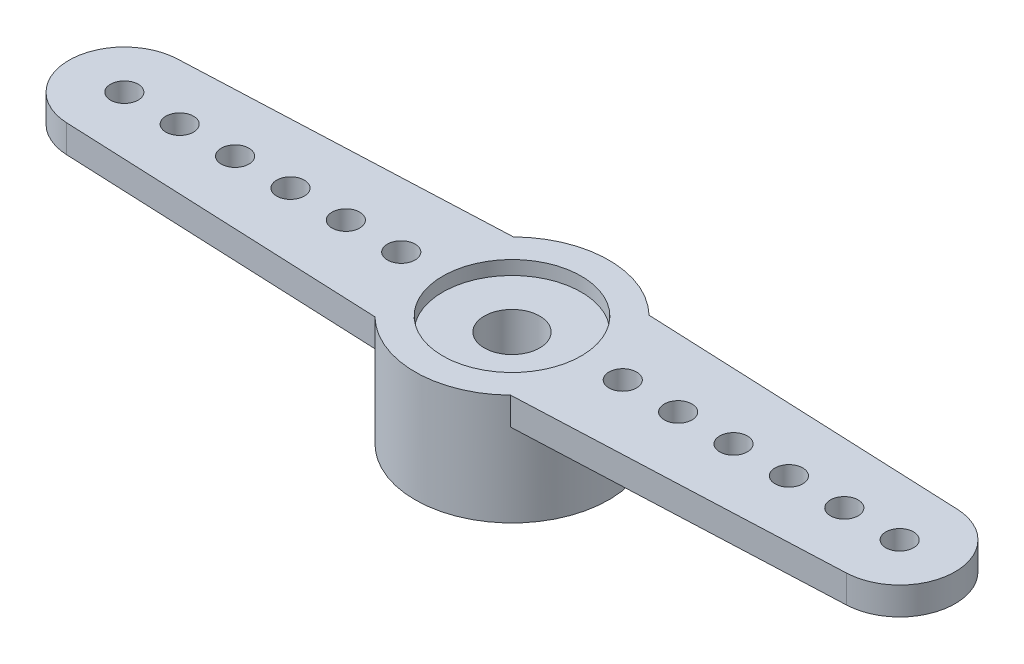
ISO-10303-21;
HEADER;
FILE_DESCRIPTION(('STEP AP214'),'2;1');
FILE_NAME('part.step','',(''),(''),'','','');
FILE_SCHEMA(('AUTOMOTIVE_DESIGN { 1 0 10303 214 1 1 1 1 }'));
ENDSEC;
DATA;
#1=APPLICATION_CONTEXT('core data for automotive mechanical design processes');
#2=APPLICATION_PROTOCOL_DEFINITION('international standard','automotive_design',2000,#1);
#3=PRODUCT_CONTEXT('',#1,'mechanical');
#4=PRODUCT('Part','Part','',(#3));
#5=PRODUCT_RELATED_PRODUCT_CATEGORY('part','',(#4));
#6=PRODUCT_DEFINITION_FORMATION('','',#4);
#7=PRODUCT_DEFINITION_CONTEXT('part definition',#1,'design');
#8=PRODUCT_DEFINITION('design','',#6,#7);
#9=PRODUCT_DEFINITION_SHAPE('','',#8);
#10=(LENGTH_UNIT() NAMED_UNIT(*) SI_UNIT(.MILLI.,.METRE.));
#11=(NAMED_UNIT(*) PLANE_ANGLE_UNIT() SI_UNIT($,.RADIAN.));
#12=(NAMED_UNIT(*) SI_UNIT($,.STERADIAN.) SOLID_ANGLE_UNIT());
#13=UNCERTAINTY_MEASURE_WITH_UNIT(LENGTH_MEASURE(1.E-05),#10,'distance_accuracy_value','');
#14=(GEOMETRIC_REPRESENTATION_CONTEXT(3) GLOBAL_UNCERTAINTY_ASSIGNED_CONTEXT((#13)) GLOBAL_UNIT_ASSIGNED_CONTEXT((#10,
#11,#12)) REPRESENTATION_CONTEXT('',''));
#15=CARTESIAN_POINT('',(0.,0.,0.));
#16=DIRECTION('',(0.,0.,1.));
#17=DIRECTION('',(1.,0.,0.));
#18=AXIS2_PLACEMENT_3D('',#15,#16,#17);
#19=CARTESIAN_POINT('',(0.,4.,0.));
#20=DIRECTION('',(0.,-1.,0.));
#21=DIRECTION('',(0.,0.,-1.));
#22=AXIS2_PLACEMENT_3D('',#19,#20,#21);
#23=CYLINDRICAL_SURFACE('',#22,3.5);
#24=CARTESIAN_POINT('',(0.,0.,0.));
#25=DIRECTION('',(0.,1.,0.));
#26=DIRECTION('',(0.,0.,1.));
#27=AXIS2_PLACEMENT_3D('',#24,#25,#26);
#28=CIRCLE('',#27,3.5);
#29=CARTESIAN_POINT('',(0.,0.,3.5));
#30=VERTEX_POINT('',#29);
#31=EDGE_CURVE('E210',#30,#30,#28,.T.);
#32=ORIENTED_EDGE('',*,*,#31,.T.);
#33=EDGE_LOOP('',(#32));
#34=FACE_BOUND('',#33,.T.);
#35=DIRECTION('',(0.,1.,0.));
#36=VECTOR('',#35,1.);
#37=CARTESIAN_POINT('',(2.44948974278318,3.,2.5));
#38=LINE('',#37,#36);
#39=CARTESIAN_POINT('',(2.44948974278318,3.,2.5));
#40=VERTEX_POINT('',#39);
#41=CARTESIAN_POINT('',(2.44948974278318,4.,2.5));
#42=VERTEX_POINT('',#41);
#43=EDGE_CURVE('E133',#40,#42,#38,.T.);
#44=ORIENTED_EDGE('',*,*,#43,.T.);
#45=CARTESIAN_POINT('',(0.,4.,0.));
#46=DIRECTION('',(0.,1.,0.));
#47=DIRECTION('',(0.,0.,1.));
#48=AXIS2_PLACEMENT_3D('',#45,#46,#47);
#49=CIRCLE('',#48,3.5);
#50=CARTESIAN_POINT('',(-2.44948974278318,4.,2.5));
#51=VERTEX_POINT('',#50);
#52=EDGE_CURVE('E50',#51,#42,#49,.T.);
#53=ORIENTED_EDGE('',*,*,#52,.F.);
#54=DIRECTION('',(0.,1.,0.));
#55=VECTOR('',#54,1.);
#56=CARTESIAN_POINT('',(-2.44948974278318,3.,2.5));
#57=LINE('',#56,#55);
#58=CARTESIAN_POINT('',(-2.44948974278318,3.,2.5));
#59=VERTEX_POINT('',#58);
#60=EDGE_CURVE('E190',#59,#51,#57,.T.);
#61=ORIENTED_EDGE('',*,*,#60,.F.);
#62=CARTESIAN_POINT('',(0.,3.,0.));
#63=DIRECTION('',(0.,1.,0.));
#64=DIRECTION('',(0.,0.,1.));
#65=AXIS2_PLACEMENT_3D('',#62,#63,#64);
#66=CIRCLE('',#65,3.5);
#67=CARTESIAN_POINT('',(-3.5,3.,0.));
#68=VERTEX_POINT('',#67);
#69=EDGE_CURVE('E174',#68,#59,#66,.T.);
#70=ORIENTED_EDGE('',*,*,#69,.F.);
#71=CARTESIAN_POINT('',(-2.44948974278318,3.,-2.5));
#72=VERTEX_POINT('',#71);
#73=EDGE_CURVE('E175',#72,#68,#66,.T.);
#74=ORIENTED_EDGE('',*,*,#73,.F.);
#75=DIRECTION('',(0.,1.,0.));
#76=VECTOR('',#75,1.);
#77=CARTESIAN_POINT('',(-2.44948974278318,3.,-2.5));
#78=LINE('',#77,#76);
#79=CARTESIAN_POINT('',(-2.44948974278318,4.,-2.5));
#80=VERTEX_POINT('',#79);
#81=EDGE_CURVE('E185',#72,#80,#78,.T.);
#82=ORIENTED_EDGE('',*,*,#81,.T.);
#83=CARTESIAN_POINT('',(2.44948974278318,4.,-2.5));
#84=VERTEX_POINT('',#83);
#85=EDGE_CURVE('E217',#84,#80,#49,.T.);
#86=ORIENTED_EDGE('',*,*,#85,.F.);
#87=DIRECTION('',(0.,1.,0.));
#88=VECTOR('',#87,1.);
#89=CARTESIAN_POINT('',(2.44948974278318,3.,-2.5));
#90=LINE('',#89,#88);
#91=CARTESIAN_POINT('',(2.44948974278318,3.,-2.5));
#92=VERTEX_POINT('',#91);
#93=EDGE_CURVE('E247',#92,#84,#90,.T.);
#94=ORIENTED_EDGE('',*,*,#93,.F.);
#95=CARTESIAN_POINT('',(0.,3.,0.));
#96=DIRECTION('',(0.,1.,0.));
#97=DIRECTION('',(0.,0.,1.));
#98=AXIS2_PLACEMENT_3D('',#95,#96,#97);
#99=CIRCLE('',#98,3.5);
#100=CARTESIAN_POINT('',(3.5,3.,0.));
#101=VERTEX_POINT('',#100);
#102=EDGE_CURVE('E151',#101,#92,#99,.T.);
#103=ORIENTED_EDGE('',*,*,#102,.F.);
#104=EDGE_CURVE('E152',#40,#101,#99,.T.);
#105=ORIENTED_EDGE('',*,*,#104,.F.);
#106=EDGE_LOOP('',(#44,#53,#61,#70,#74,#82,#86,#94,#103,#105));
#107=FACE_BOUND('',#106,.T.);
#108=ADVANCED_FACE('F41',(#34,#107),#23,.T.);
#109=CARTESIAN_POINT('',(0.,4.,0.));
#110=DIRECTION('',(0.,-1.,0.));
#111=DIRECTION('',(0.,0.,-1.));
#112=AXIS2_PLACEMENT_3D('',#109,#110,#111);
#113=CYLINDRICAL_SURFACE('',#112,2.5);
#114=CARTESIAN_POINT('',(0.,0.,0.));
#115=DIRECTION('',(0.,1.,0.));
#116=DIRECTION('',(0.,0.,1.));
#117=AXIS2_PLACEMENT_3D('',#114,#115,#116);
#118=CIRCLE('',#117,2.5);
#119=CARTESIAN_POINT('',(0.,0.,2.5));
#120=VERTEX_POINT('',#119);
#121=EDGE_CURVE('E211',#120,#120,#118,.T.);
#122=ORIENTED_EDGE('',*,*,#121,.F.);
#123=EDGE_LOOP('',(#122));
#124=FACE_BOUND('',#123,.T.);
#125=CARTESIAN_POINT('',(0.,2.,0.));
#126=DIRECTION('',(0.,1.,0.));
#127=DIRECTION('',(0.,0.,1.));
#128=AXIS2_PLACEMENT_3D('',#125,#126,#127);
#129=CIRCLE('',#128,2.5);
#130=CARTESIAN_POINT('',(0.,2.,2.5));
#131=VERTEX_POINT('',#130);
#132=EDGE_CURVE('E44',#131,#131,#129,.T.);
#133=ORIENTED_EDGE('',*,*,#132,.T.);
#134=EDGE_LOOP('',(#133));
#135=FACE_BOUND('',#134,.T.);
#136=ADVANCED_FACE('F353',(#124,#135),#113,.F.);
#137=CARTESIAN_POINT('',(0.,4.,0.));
#138=DIRECTION('',(0.,1.,0.));
#139=DIRECTION('',(0.,0.,1.));
#140=AXIS2_PLACEMENT_3D('',#137,#138,#139);
#141=PLANE('',#140);
#142=CARTESIAN_POINT('',(14.,4.,0.));
#143=DIRECTION('',(0.,1.,0.));
#144=DIRECTION('',(0.,0.,1.));
#145=AXIS2_PLACEMENT_3D('',#142,#143,#144);
#146=CIRCLE('',#145,0.500000000000001);
#147=CARTESIAN_POINT('',(14.,4.,0.500000000000001));
#148=VERTEX_POINT('',#147);
#149=EDGE_CURVE('E297',#148,#148,#146,.T.);
#150=ORIENTED_EDGE('',*,*,#149,.F.);
#151=EDGE_LOOP('',(#150));
#152=FACE_BOUND('',#151,.T.);
#153=CARTESIAN_POINT('',(-14.,4.,0.));
#154=DIRECTION('',(0.,1.,0.));
#155=DIRECTION('',(0.,0.,-1.));
#156=AXIS2_PLACEMENT_3D('',#153,#154,#155);
#157=CIRCLE('',#156,0.500000000000001);
#158=CARTESIAN_POINT('',(-14.,4.,-0.500000000000001));
#159=VERTEX_POINT('',#158);
#160=EDGE_CURVE('E298',#159,#159,#157,.T.);
#161=ORIENTED_EDGE('',*,*,#160,.F.);
#162=EDGE_LOOP('',(#161));
#163=FACE_BOUND('',#162,.T.);
#164=CARTESIAN_POINT('',(-12.,4.,0.));
#165=DIRECTION('',(0.,1.,0.));
#166=DIRECTION('',(0.,0.,-1.));
#167=AXIS2_PLACEMENT_3D('',#164,#165,#166);
#168=CIRCLE('',#167,0.500000000000001);
#169=CARTESIAN_POINT('',(-12.,4.,-0.500000000000001));
#170=VERTEX_POINT('',#169);
#171=EDGE_CURVE('E313',#170,#170,#168,.T.);
#172=ORIENTED_EDGE('',*,*,#171,.F.);
#173=EDGE_LOOP('',(#172));
#174=FACE_BOUND('',#173,.T.);
#175=CARTESIAN_POINT('',(-10.,4.,0.));
#176=DIRECTION('',(0.,1.,0.));
#177=DIRECTION('',(0.,0.,-1.));
#178=AXIS2_PLACEMENT_3D('',#175,#176,#177);
#179=CIRCLE('',#178,0.500000000000001);
#180=CARTESIAN_POINT('',(-10.,4.,-0.500000000000001));
#181=VERTEX_POINT('',#180);
#182=EDGE_CURVE('E314',#181,#181,#179,.T.);
#183=ORIENTED_EDGE('',*,*,#182,.F.);
#184=EDGE_LOOP('',(#183));
#185=FACE_BOUND('',#184,.T.);
#186=CARTESIAN_POINT('',(12.,4.,0.));
#187=DIRECTION('',(0.,1.,0.));
#188=DIRECTION('',(0.,0.,1.));
#189=AXIS2_PLACEMENT_3D('',#186,#187,#188);
#190=CIRCLE('',#189,0.500000000000001);
#191=CARTESIAN_POINT('',(12.,4.,0.500000000000001));
#192=VERTEX_POINT('',#191);
#193=EDGE_CURVE('E266',#192,#192,#190,.T.);
#194=ORIENTED_EDGE('',*,*,#193,.F.);
#195=EDGE_LOOP('',(#194));
#196=FACE_BOUND('',#195,.T.);
#197=CARTESIAN_POINT('',(10.,4.,0.));
#198=DIRECTION('',(0.,1.,0.));
#199=DIRECTION('',(0.,0.,1.));
#200=AXIS2_PLACEMENT_3D('',#197,#198,#199);
#201=CIRCLE('',#200,0.500000000000001);
#202=CARTESIAN_POINT('',(10.,4.,0.500000000000001));
#203=VERTEX_POINT('',#202);
#204=EDGE_CURVE('E265',#203,#203,#201,.T.);
#205=ORIENTED_EDGE('',*,*,#204,.F.);
#206=EDGE_LOOP('',(#205));
#207=FACE_BOUND('',#206,.T.);
#208=CARTESIAN_POINT('',(8.,4.,0.));
#209=DIRECTION('',(0.,1.,0.));
#210=DIRECTION('',(0.,0.,1.));
#211=AXIS2_PLACEMENT_3D('',#208,#209,#210);
#212=CIRCLE('',#211,0.500000000000001);
#213=CARTESIAN_POINT('',(8.,4.,0.500000000000001));
#214=VERTEX_POINT('',#213);
#215=EDGE_CURVE('E275',#214,#214,#212,.T.);
#216=ORIENTED_EDGE('',*,*,#215,.F.);
#217=EDGE_LOOP('',(#216));
#218=FACE_BOUND('',#217,.T.);
#219=CARTESIAN_POINT('',(6.,4.,0.));
#220=DIRECTION('',(0.,1.,0.));
#221=DIRECTION('',(0.,0.,1.));
#222=AXIS2_PLACEMENT_3D('',#219,#220,#221);
#223=CIRCLE('',#222,0.500000000000001);
#224=CARTESIAN_POINT('',(6.,4.,0.500000000000001));
#225=VERTEX_POINT('',#224);
#226=EDGE_CURVE('E283',#225,#225,#223,.T.);
#227=ORIENTED_EDGE('',*,*,#226,.F.);
#228=EDGE_LOOP('',(#227));
#229=FACE_BOUND('',#228,.T.);
#230=CARTESIAN_POINT('',(-8.,4.,0.));
#231=DIRECTION('',(0.,1.,0.));
#232=DIRECTION('',(0.,0.,-1.));
#233=AXIS2_PLACEMENT_3D('',#230,#231,#232);
#234=CIRCLE('',#233,0.500000000000001);
#235=CARTESIAN_POINT('',(-8.,4.,-0.500000000000001));
#236=VERTEX_POINT('',#235);
#237=EDGE_CURVE('E336',#236,#236,#234,.T.);
#238=ORIENTED_EDGE('',*,*,#237,.F.);
#239=EDGE_LOOP('',(#238));
#240=FACE_BOUND('',#239,.T.);
#241=CARTESIAN_POINT('',(-6.,4.,0.));
#242=DIRECTION('',(0.,1.,0.));
#243=DIRECTION('',(0.,0.,-1.));
#244=AXIS2_PLACEMENT_3D('',#241,#242,#243);
#245=CIRCLE('',#244,0.500000000000001);
#246=CARTESIAN_POINT('',(-6.,4.,-0.500000000000001));
#247=VERTEX_POINT('',#246);
#248=EDGE_CURVE('E327',#247,#247,#245,.T.);
#249=ORIENTED_EDGE('',*,*,#248,.F.);
#250=EDGE_LOOP('',(#249));
#251=FACE_BOUND('',#250,.T.);
#252=CARTESIAN_POINT('',(-4.,4.,0.));
#253=DIRECTION('',(0.,1.,0.));
#254=DIRECTION('',(0.,0.,-1.));
#255=AXIS2_PLACEMENT_3D('',#252,#253,#254);
#256=CIRCLE('',#255,0.500000000000001);
#257=CARTESIAN_POINT('',(-4.,4.,-0.500000000000001));
#258=VERTEX_POINT('',#257);
#259=EDGE_CURVE('E328',#258,#258,#256,.T.);
#260=ORIENTED_EDGE('',*,*,#259,.F.);
#261=EDGE_LOOP('',(#260));
#262=FACE_BOUND('',#261,.T.);
#263=CARTESIAN_POINT('',(4.,4.,0.));
#264=DIRECTION('',(0.,1.,0.));
#265=DIRECTION('',(0.,0.,1.));
#266=AXIS2_PLACEMENT_3D('',#263,#264,#265);
#267=CIRCLE('',#266,0.500000000000001);
#268=CARTESIAN_POINT('',(4.,4.,0.500000000000001));
#269=VERTEX_POINT('',#268);
#270=EDGE_CURVE('E256',#269,#269,#267,.T.);
#271=ORIENTED_EDGE('',*,*,#270,.F.);
#272=EDGE_LOOP('',(#271));
#273=FACE_BOUND('',#272,.T.);
#274=ORIENTED_EDGE('',*,*,#52,.T.);
#275=DIRECTION('',(-0.999071318541253,0.,0.0430871264792976));
#276=VECTOR('',#275,1.);
#277=CARTESIAN_POINT('',(0.112165259513997,4.,2.60080220877607));
#278=LINE('',#277,#276);
#279=CARTESIAN_POINT('',(14.0861742529586,4.,1.99814263708251));
#280=VERTEX_POINT('',#279);
#281=EDGE_CURVE('E111',#280,#42,#278,.T.);
#282=ORIENTED_EDGE('',*,*,#281,.F.);
#283=CARTESIAN_POINT('',(14.,4.,0.));
#284=DIRECTION('',(0.,1.,0.));
#285=DIRECTION('',(0.,0.,1.));
#286=AXIS2_PLACEMENT_3D('',#283,#284,#285);
#287=CIRCLE('',#286,2.00000000000001);
#288=CARTESIAN_POINT('',(14.0861742529586,4.,-1.99814263708251));
#289=VERTEX_POINT('',#288);
#290=EDGE_CURVE('E116',#289,#280,#287,.F.);
#291=ORIENTED_EDGE('',*,*,#290,.F.);
#292=DIRECTION('',(0.999071318541253,0.,0.0430871264792976));
#293=VECTOR('',#292,1.);
#294=CARTESIAN_POINT('',(0.112165259513997,4.,-2.60080220877607));
#295=LINE('',#294,#293);
#296=EDGE_CURVE('E122',#84,#289,#295,.T.);
#297=ORIENTED_EDGE('',*,*,#296,.F.);
#298=ORIENTED_EDGE('',*,*,#85,.T.);
#299=DIRECTION('',(-0.999071318541253,0.,0.0430871264792976));
#300=VECTOR('',#299,1.);
#301=CARTESIAN_POINT('',(-0.112165259513997,4.,-2.60080220877607));
#302=LINE('',#301,#300);
#303=CARTESIAN_POINT('',(-14.0861742529586,4.,-1.99814263708251));
#304=VERTEX_POINT('',#303);
#305=EDGE_CURVE('E140',#80,#304,#302,.T.);
#306=ORIENTED_EDGE('',*,*,#305,.T.);
#307=CARTESIAN_POINT('',(-14.,4.,0.));
#308=DIRECTION('',(0.,1.,0.));
#309=DIRECTION('',(0.,0.,1.));
#310=AXIS2_PLACEMENT_3D('',#307,#308,#309);
#311=CIRCLE('',#310,2.);
#312=CARTESIAN_POINT('',(-14.0861742529586,4.,1.99814263708251));
#313=VERTEX_POINT('',#312);
#314=EDGE_CURVE('E145',#304,#313,#311,.T.);
#315=ORIENTED_EDGE('',*,*,#314,.T.);
#316=DIRECTION('',(0.999071318541253,0.,0.0430871264792982));
#317=VECTOR('',#316,1.);
#318=CARTESIAN_POINT('',(-0.112165259513999,4.,2.60080220877607));
#319=LINE('',#318,#317);
#320=EDGE_CURVE('E166',#313,#51,#319,.T.);
#321=ORIENTED_EDGE('',*,*,#320,.T.);
#322=EDGE_LOOP('',(#274,#282,#291,#297,#298,#306,#315,#321));
#323=FACE_BOUND('',#322,.T.);
#324=CARTESIAN_POINT('',(0.,4.,0.));
#325=DIRECTION('',(0.,1.,0.));
#326=DIRECTION('',(0.,0.,1.));
#327=AXIS2_PLACEMENT_3D('',#324,#325,#326);
#328=CIRCLE('',#327,2.5);
#329=CARTESIAN_POINT('',(0.,4.,2.5));
#330=VERTEX_POINT('',#329);
#331=EDGE_CURVE('E206',#330,#330,#328,.T.);
#332=ORIENTED_EDGE('',*,*,#331,.F.);
#333=EDGE_LOOP('',(#332));
#334=FACE_BOUND('',#333,.T.);
#335=ADVANCED_FACE('F113',(#152,#163,#174,#185,#196,#207,#218,#229,#240,#251,#262,#273,#323,
#334),#141,.T.);
#336=CARTESIAN_POINT('',(0.,0.,0.));
#337=DIRECTION('',(0.,1.,0.));
#338=DIRECTION('',(0.,0.,1.));
#339=AXIS2_PLACEMENT_3D('',#336,#337,#338);
#340=PLANE('',#339);
#341=ORIENTED_EDGE('',*,*,#31,.F.);
#342=EDGE_LOOP('',(#341));
#343=FACE_BOUND('',#342,.T.);
#344=ORIENTED_EDGE('',*,*,#121,.T.);
#345=EDGE_LOOP('',(#344));
#346=FACE_BOUND('',#345,.T.);
#347=ADVANCED_FACE('F352',(#343,#346),#340,.F.);
#348=CARTESIAN_POINT('',(0.,3.5,0.));
#349=DIRECTION('',(0.,1.,0.));
#350=DIRECTION('',(0.,0.,1.));
#351=AXIS2_PLACEMENT_3D('',#348,#349,#350);
#352=CIRCLE('',#351,2.5);
#353=CARTESIAN_POINT('',(0.,3.5,2.5));
#354=VERTEX_POINT('',#353);
#355=EDGE_CURVE('E11',#354,#354,#352,.T.);
#356=ORIENTED_EDGE('',*,*,#355,.F.);
#357=EDGE_LOOP('',(#356));
#358=FACE_BOUND('',#357,.T.);
#359=ORIENTED_EDGE('',*,*,#331,.T.);
#360=EDGE_LOOP('',(#359));
#361=FACE_BOUND('',#360,.T.);
#362=ADVANCED_FACE('F385',(#358,#361),#113,.F.);
#363=CARTESIAN_POINT('',(0.,2.,0.));
#364=DIRECTION('',(0.,1.,0.));
#365=DIRECTION('',(0.,0.,1.));
#366=AXIS2_PLACEMENT_3D('',#363,#364,#365);
#367=PLANE('',#366);
#368=CARTESIAN_POINT('',(0.,2.,0.));
#369=DIRECTION('',(0.,1.,0.));
#370=DIRECTION('',(0.,0.,1.));
#371=AXIS2_PLACEMENT_3D('',#368,#369,#370);
#372=CIRCLE('',#371,1.);
#373=CARTESIAN_POINT('',(0.,2.,1.));
#374=VERTEX_POINT('',#373);
#375=EDGE_CURVE('E199',#374,#374,#372,.T.);
#376=ORIENTED_EDGE('',*,*,#375,.T.);
#377=EDGE_LOOP('',(#376));
#378=FACE_BOUND('',#377,.T.);
#379=ORIENTED_EDGE('',*,*,#132,.F.);
#380=EDGE_LOOP('',(#379));
#381=FACE_BOUND('',#380,.T.);
#382=ADVANCED_FACE('F392',(#378,#381),#367,.F.);
#383=CARTESIAN_POINT('',(0.,3.5,0.));
#384=DIRECTION('',(0.,1.,0.));
#385=DIRECTION('',(0.,0.,1.));
#386=AXIS2_PLACEMENT_3D('',#383,#384,#385);
#387=PLANE('',#386);
#388=CARTESIAN_POINT('',(0.,3.5,0.));
#389=DIRECTION('',(0.,1.,0.));
#390=DIRECTION('',(0.,0.,1.));
#391=AXIS2_PLACEMENT_3D('',#388,#389,#390);
#392=CIRCLE('',#391,1.);
#393=CARTESIAN_POINT('',(0.,3.5,1.));
#394=VERTEX_POINT('',#393);
#395=EDGE_CURVE('E189',#394,#394,#392,.T.);
#396=ORIENTED_EDGE('',*,*,#395,.F.);
#397=EDGE_LOOP('',(#396));
#398=FACE_BOUND('',#397,.T.);
#399=ORIENTED_EDGE('',*,*,#355,.T.);
#400=EDGE_LOOP('',(#399));
#401=FACE_BOUND('',#400,.T.);
#402=ADVANCED_FACE('F398',(#398,#401),#387,.T.);
#403=CARTESIAN_POINT('',(0.,2.,0.));
#404=DIRECTION('',(0.,1.,0.));
#405=DIRECTION('',(0.,0.,1.));
#406=AXIS2_PLACEMENT_3D('',#403,#404,#405);
#407=CYLINDRICAL_SURFACE('',#406,1.);
#408=ORIENTED_EDGE('',*,*,#375,.F.);
#409=EDGE_LOOP('',(#408));
#410=FACE_BOUND('',#409,.T.);
#411=ORIENTED_EDGE('',*,*,#395,.T.);
#412=EDGE_LOOP('',(#411));
#413=FACE_BOUND('',#412,.T.);
#414=ADVANCED_FACE('F407',(#410,#413),#407,.F.);
#415=CARTESIAN_POINT('',(-0.112165259513997,3.,-2.60080220877607));
#416=DIRECTION('',(-0.0430871264792976,0.,-0.999071318541253));
#417=DIRECTION('',(-0.999071318541253,0.,0.0430871264792976));
#418=AXIS2_PLACEMENT_3D('',#415,#416,#417);
#419=PLANE('',#418);
#420=ORIENTED_EDGE('',*,*,#305,.F.);
#421=ORIENTED_EDGE('',*,*,#81,.F.);
#422=DIRECTION('',(-0.999071318541253,0.,0.0430871264792976));
#423=VECTOR('',#422,1.);
#424=CARTESIAN_POINT('',(-0.112165259513997,3.,-2.60080220877607));
#425=LINE('',#424,#423);
#426=CARTESIAN_POINT('',(-14.0861742529586,3.,-1.99814263708251));
#427=VERTEX_POINT('',#426);
#428=EDGE_CURVE('E161',#72,#427,#425,.T.);
#429=ORIENTED_EDGE('',*,*,#428,.T.);
#430=DIRECTION('',(0.,1.,0.));
#431=VECTOR('',#430,1.);
#432=CARTESIAN_POINT('',(-14.0861742529586,3.,-1.99814263708251));
#433=LINE('',#432,#431);
#434=EDGE_CURVE('E178',#427,#304,#433,.T.);
#435=ORIENTED_EDGE('',*,*,#434,.T.);
#436=EDGE_LOOP('',(#420,#421,#429,#435));
#437=FACE_BOUND('',#436,.T.);
#438=ADVANCED_FACE('F229',(#437),#419,.T.);
#439=CARTESIAN_POINT('',(-0.112165259513999,3.,2.60080220877607));
#440=DIRECTION('',(-0.0430871264792982,0.,0.999071318541253));
#441=DIRECTION('',(0.999071318541253,0.,0.0430871264792982));
#442=AXIS2_PLACEMENT_3D('',#439,#440,#441);
#443=PLANE('',#442);
#444=ORIENTED_EDGE('',*,*,#320,.F.);
#445=DIRECTION('',(0.,1.,0.));
#446=VECTOR('',#445,1.);
#447=CARTESIAN_POINT('',(-14.0861742529586,3.,1.99814263708251));
#448=LINE('',#447,#446);
#449=CARTESIAN_POINT('',(-14.0861742529586,3.,1.99814263708251));
#450=VERTEX_POINT('',#449);
#451=EDGE_CURVE('E194',#450,#313,#448,.T.);
#452=ORIENTED_EDGE('',*,*,#451,.F.);
#453=DIRECTION('',(0.999071318541253,0.,0.0430871264792982));
#454=VECTOR('',#453,1.);
#455=CARTESIAN_POINT('',(-0.112165259513999,3.,2.60080220877607));
#456=LINE('',#455,#454);
#457=EDGE_CURVE('E170',#450,#59,#456,.T.);
#458=ORIENTED_EDGE('',*,*,#457,.T.);
#459=ORIENTED_EDGE('',*,*,#60,.T.);
#460=EDGE_LOOP('',(#444,#452,#458,#459));
#461=FACE_BOUND('',#460,.T.);
#462=ADVANCED_FACE('F243',(#461),#443,.T.);
#463=CARTESIAN_POINT('',(-14.,3.,0.));
#464=DIRECTION('',(0.,1.,0.));
#465=DIRECTION('',(0.,0.,1.));
#466=AXIS2_PLACEMENT_3D('',#463,#464,#465);
#467=CYLINDRICAL_SURFACE('',#466,2.);
#468=ORIENTED_EDGE('',*,*,#314,.F.);
#469=ORIENTED_EDGE('',*,*,#434,.F.);
#470=CARTESIAN_POINT('',(-14.,3.,0.));
#471=DIRECTION('',(0.,1.,0.));
#472=DIRECTION('',(0.,0.,1.));
#473=AXIS2_PLACEMENT_3D('',#470,#471,#472);
#474=CIRCLE('',#473,2.);
#475=EDGE_CURVE('E165',#427,#450,#474,.T.);
#476=ORIENTED_EDGE('',*,*,#475,.T.);
#477=ORIENTED_EDGE('',*,*,#451,.T.);
#478=EDGE_LOOP('',(#468,#469,#476,#477));
#479=FACE_BOUND('',#478,.T.);
#480=ADVANCED_FACE('F240',(#479),#467,.T.);
#481=CARTESIAN_POINT('',(0.,3.,0.));
#482=DIRECTION('',(0.,1.,0.));
#483=DIRECTION('',(0.,0.,1.));
#484=AXIS2_PLACEMENT_3D('',#481,#482,#483);
#485=PLANE('',#484);
#486=CARTESIAN_POINT('',(-14.,3.,0.));
#487=DIRECTION('',(0.,1.,0.));
#488=DIRECTION('',(0.,0.,1.));
#489=AXIS2_PLACEMENT_3D('',#486,#487,#488);
#490=CIRCLE('',#489,0.500000000000001);
#491=CARTESIAN_POINT('',(-14.,3.,0.500000000000001));
#492=VERTEX_POINT('',#491);
#493=EDGE_CURVE('E293',#492,#492,#490,.F.);
#494=ORIENTED_EDGE('',*,*,#493,.F.);
#495=EDGE_LOOP('',(#494));
#496=FACE_BOUND('',#495,.T.);
#497=CARTESIAN_POINT('',(-12.,3.,0.));
#498=DIRECTION('',(0.,1.,0.));
#499=DIRECTION('',(0.,0.,1.));
#500=AXIS2_PLACEMENT_3D('',#497,#498,#499);
#501=CIRCLE('',#500,0.500000000000001);
#502=CARTESIAN_POINT('',(-12.,3.,0.500000000000001));
#503=VERTEX_POINT('',#502);
#504=EDGE_CURVE('E302',#503,#503,#501,.F.);
#505=ORIENTED_EDGE('',*,*,#504,.F.);
#506=EDGE_LOOP('',(#505));
#507=FACE_BOUND('',#506,.T.);
#508=CARTESIAN_POINT('',(-10.,3.,0.));
#509=DIRECTION('',(0.,1.,0.));
#510=DIRECTION('',(0.,0.,1.));
#511=AXIS2_PLACEMENT_3D('',#508,#509,#510);
#512=CIRCLE('',#511,0.500000000000001);
#513=CARTESIAN_POINT('',(-10.,3.,0.500000000000001));
#514=VERTEX_POINT('',#513);
#515=EDGE_CURVE('E309',#514,#514,#512,.F.);
#516=ORIENTED_EDGE('',*,*,#515,.F.);
#517=EDGE_LOOP('',(#516));
#518=FACE_BOUND('',#517,.T.);
#519=CARTESIAN_POINT('',(-8.,3.,0.));
#520=DIRECTION('',(0.,1.,0.));
#521=DIRECTION('',(0.,0.,1.));
#522=AXIS2_PLACEMENT_3D('',#519,#520,#521);
#523=CIRCLE('',#522,0.500000000000001);
#524=CARTESIAN_POINT('',(-8.,3.,0.500000000000001));
#525=VERTEX_POINT('',#524);
#526=EDGE_CURVE('E318',#525,#525,#523,.F.);
#527=ORIENTED_EDGE('',*,*,#526,.F.);
#528=EDGE_LOOP('',(#527));
#529=FACE_BOUND('',#528,.T.);
#530=CARTESIAN_POINT('',(-6.,3.,0.));
#531=DIRECTION('',(0.,1.,0.));
#532=DIRECTION('',(0.,0.,1.));
#533=AXIS2_PLACEMENT_3D('',#530,#531,#532);
#534=CIRCLE('',#533,0.500000000000001);
#535=CARTESIAN_POINT('',(-6.,3.,0.500000000000001));
#536=VERTEX_POINT('',#535);
#537=EDGE_CURVE('E332',#536,#536,#534,.F.);
#538=ORIENTED_EDGE('',*,*,#537,.F.);
#539=EDGE_LOOP('',(#538));
#540=FACE_BOUND('',#539,.T.);
#541=ORIENTED_EDGE('',*,*,#73,.T.);
#542=CARTESIAN_POINT('',(-4.,3.,0.));
#543=DIRECTION('',(0.,1.,0.));
#544=DIRECTION('',(0.,0.,1.));
#545=AXIS2_PLACEMENT_3D('',#542,#543,#544);
#546=CIRCLE('',#545,0.500000000000001);
#547=EDGE_CURVE('E55',#68,#68,#546,.F.);
#548=ORIENTED_EDGE('',*,*,#547,.F.);
#549=ORIENTED_EDGE('',*,*,#69,.T.);
#550=ORIENTED_EDGE('',*,*,#457,.F.);
#551=ORIENTED_EDGE('',*,*,#475,.F.);
#552=ORIENTED_EDGE('',*,*,#428,.F.);
#553=EDGE_LOOP('',(#541,#548,#549,#550,#551,#552));
#554=FACE_BOUND('',#553,.T.);
#555=ADVANCED_FACE('F236',(#496,#507,#518,#529,#540,#554),#485,.F.);
#556=CARTESIAN_POINT('',(14.,3.,0.));
#557=DIRECTION('',(0.,1.,0.));
#558=DIRECTION('',(0.,0.,1.));
#559=AXIS2_PLACEMENT_3D('',#556,#557,#558);
#560=CYLINDRICAL_SURFACE('',#559,2.00000000000001);
#561=ORIENTED_EDGE('',*,*,#290,.T.);
#562=DIRECTION('',(0.,1.,0.));
#563=VECTOR('',#562,1.);
#564=CARTESIAN_POINT('',(14.0861742529586,3.,1.99814263708251));
#565=LINE('',#564,#563);
#566=CARTESIAN_POINT('',(14.0861742529586,3.,1.99814263708251));
#567=VERTEX_POINT('',#566);
#568=EDGE_CURVE('E126',#567,#280,#565,.T.);
#569=ORIENTED_EDGE('',*,*,#568,.F.);
#570=CARTESIAN_POINT('',(14.,3.,0.));
#571=DIRECTION('',(0.,1.,0.));
#572=DIRECTION('',(0.,0.,1.));
#573=AXIS2_PLACEMENT_3D('',#570,#571,#572);
#574=CIRCLE('',#573,2.00000000000001);
#575=CARTESIAN_POINT('',(14.0861742529586,3.,-1.99814263708251));
#576=VERTEX_POINT('',#575);
#577=EDGE_CURVE('E123',#576,#567,#574,.F.);
#578=ORIENTED_EDGE('',*,*,#577,.F.);
#579=DIRECTION('',(0.,1.,0.));
#580=VECTOR('',#579,1.);
#581=CARTESIAN_POINT('',(14.0861742529586,3.,-1.99814263708251));
#582=LINE('',#581,#580);
#583=EDGE_CURVE('E138',#576,#289,#582,.T.);
#584=ORIENTED_EDGE('',*,*,#583,.T.);
#585=EDGE_LOOP('',(#561,#569,#578,#584));
#586=FACE_BOUND('',#585,.T.);
#587=ADVANCED_FACE('F136',(#586),#560,.T.);
#588=CARTESIAN_POINT('',(0.112165259513997,3.,2.60080220877607));
#589=DIRECTION('',(-0.0430871264792976,0.,-0.999071318541253));
#590=DIRECTION('',(-0.999071318541253,0.,0.0430871264792976));
#591=AXIS2_PLACEMENT_3D('',#588,#589,#590);
#592=PLANE('',#591);
#593=ORIENTED_EDGE('',*,*,#281,.T.);
#594=ORIENTED_EDGE('',*,*,#43,.F.);
#595=DIRECTION('',(-0.999071318541253,0.,0.0430871264792976));
#596=VECTOR('',#595,1.);
#597=CARTESIAN_POINT('',(0.112165259513997,3.,2.60080220877607));
#598=LINE('',#597,#596);
#599=EDGE_CURVE('E128',#567,#40,#598,.T.);
#600=ORIENTED_EDGE('',*,*,#599,.F.);
#601=ORIENTED_EDGE('',*,*,#568,.T.);
#602=EDGE_LOOP('',(#593,#594,#600,#601));
#603=FACE_BOUND('',#602,.T.);
#604=ADVANCED_FACE('F127',(#603),#592,.F.);
#605=CARTESIAN_POINT('',(0.112165259513997,3.,-2.60080220877607));
#606=DIRECTION('',(-0.0430871264792976,0.,0.999071318541253));
#607=DIRECTION('',(0.999071318541253,0.,0.0430871264792976));
#608=AXIS2_PLACEMENT_3D('',#605,#606,#607);
#609=PLANE('',#608);
#610=ORIENTED_EDGE('',*,*,#296,.T.);
#611=ORIENTED_EDGE('',*,*,#583,.F.);
#612=DIRECTION('',(0.999071318541253,0.,0.0430871264792976));
#613=VECTOR('',#612,1.);
#614=CARTESIAN_POINT('',(0.112165259513997,3.,-2.60080220877607));
#615=LINE('',#614,#613);
#616=EDGE_CURVE('E156',#92,#576,#615,.T.);
#617=ORIENTED_EDGE('',*,*,#616,.F.);
#618=ORIENTED_EDGE('',*,*,#93,.T.);
#619=EDGE_LOOP('',(#610,#611,#617,#618));
#620=FACE_BOUND('',#619,.T.);
#621=ADVANCED_FACE('F374',(#620),#609,.F.);
#622=CARTESIAN_POINT('',(0.,3.,0.));
#623=DIRECTION('',(0.,1.,0.));
#624=DIRECTION('',(0.,0.,1.));
#625=AXIS2_PLACEMENT_3D('',#622,#623,#624);
#626=PLANE('',#625);
#627=CARTESIAN_POINT('',(14.,3.,0.));
#628=DIRECTION('',(0.,1.,0.));
#629=DIRECTION('',(0.,0.,1.));
#630=AXIS2_PLACEMENT_3D('',#627,#628,#629);
#631=CIRCLE('',#630,0.500000000000001);
#632=CARTESIAN_POINT('',(14.,3.,0.500000000000001));
#633=VERTEX_POINT('',#632);
#634=EDGE_CURVE('E270',#633,#633,#631,.F.);
#635=ORIENTED_EDGE('',*,*,#634,.F.);
#636=EDGE_LOOP('',(#635));
#637=FACE_BOUND('',#636,.T.);
#638=CARTESIAN_POINT('',(12.,3.,0.));
#639=DIRECTION('',(0.,1.,0.));
#640=DIRECTION('',(0.,0.,1.));
#641=AXIS2_PLACEMENT_3D('',#638,#639,#640);
#642=CIRCLE('',#641,0.500000000000001);
#643=CARTESIAN_POINT('',(12.,3.,0.500000000000001));
#644=VERTEX_POINT('',#643);
#645=EDGE_CURVE('E261',#644,#644,#642,.F.);
#646=ORIENTED_EDGE('',*,*,#645,.F.);
#647=EDGE_LOOP('',(#646));
#648=FACE_BOUND('',#647,.T.);
#649=CARTESIAN_POINT('',(10.,3.,0.));
#650=DIRECTION('',(0.,1.,0.));
#651=DIRECTION('',(0.,0.,1.));
#652=AXIS2_PLACEMENT_3D('',#649,#650,#651);
#653=CIRCLE('',#652,0.500000000000001);
#654=CARTESIAN_POINT('',(10.,3.,0.500000000000001));
#655=VERTEX_POINT('',#654);
#656=EDGE_CURVE('E271',#655,#655,#653,.F.);
#657=ORIENTED_EDGE('',*,*,#656,.F.);
#658=EDGE_LOOP('',(#657));
#659=FACE_BOUND('',#658,.T.);
#660=CARTESIAN_POINT('',(8.,3.,0.));
#661=DIRECTION('',(0.,1.,0.));
#662=DIRECTION('',(0.,0.,1.));
#663=AXIS2_PLACEMENT_3D('',#660,#661,#662);
#664=CIRCLE('',#663,0.500000000000001);
#665=CARTESIAN_POINT('',(8.,3.,0.500000000000001));
#666=VERTEX_POINT('',#665);
#667=EDGE_CURVE('E279',#666,#666,#664,.F.);
#668=ORIENTED_EDGE('',*,*,#667,.F.);
#669=EDGE_LOOP('',(#668));
#670=FACE_BOUND('',#669,.T.);
#671=CARTESIAN_POINT('',(6.,3.,0.));
#672=DIRECTION('',(0.,1.,0.));
#673=DIRECTION('',(0.,0.,1.));
#674=AXIS2_PLACEMENT_3D('',#671,#672,#673);
#675=CIRCLE('',#674,0.500000000000001);
#676=CARTESIAN_POINT('',(6.,3.,0.500000000000001));
#677=VERTEX_POINT('',#676);
#678=EDGE_CURVE('E260',#677,#677,#675,.F.);
#679=ORIENTED_EDGE('',*,*,#678,.F.);
#680=EDGE_LOOP('',(#679));
#681=FACE_BOUND('',#680,.T.);
#682=ORIENTED_EDGE('',*,*,#104,.T.);
#683=CARTESIAN_POINT('',(4.,3.,0.));
#684=DIRECTION('',(0.,1.,0.));
#685=DIRECTION('',(0.,0.,1.));
#686=AXIS2_PLACEMENT_3D('',#683,#684,#685);
#687=CIRCLE('',#686,0.500000000000001);
#688=EDGE_CURVE('E60',#101,#101,#687,.F.);
#689=ORIENTED_EDGE('',*,*,#688,.F.);
#690=ORIENTED_EDGE('',*,*,#102,.T.);
#691=ORIENTED_EDGE('',*,*,#616,.T.);
#692=ORIENTED_EDGE('',*,*,#577,.T.);
#693=ORIENTED_EDGE('',*,*,#599,.T.);
#694=EDGE_LOOP('',(#682,#689,#690,#691,#692,#693));
#695=FACE_BOUND('',#694,.T.);
#696=ADVANCED_FACE('F365',(#637,#648,#659,#670,#681,#695),#626,.F.);
#697=CARTESIAN_POINT('',(4.,-0.00100000000000013,0.));
#698=DIRECTION('',(0.,1.,0.));
#699=DIRECTION('',(0.,0.,1.));
#700=AXIS2_PLACEMENT_3D('',#697,#698,#699);
#701=CYLINDRICAL_SURFACE('',#700,0.500000000000001);
#702=ORIENTED_EDGE('',*,*,#270,.T.);
#703=EDGE_LOOP('',(#702));
#704=FACE_BOUND('',#703,.T.);
#705=ORIENTED_EDGE('',*,*,#688,.T.);
#706=EDGE_LOOP('',(#705));
#707=FACE_BOUND('',#706,.T.);
#708=ADVANCED_FACE('F362',(#704,#707),#701,.F.);
#709=CARTESIAN_POINT('',(6.,-0.00100000000000013,0.));
#710=DIRECTION('',(0.,1.,0.));
#711=DIRECTION('',(0.,0.,1.));
#712=AXIS2_PLACEMENT_3D('',#709,#710,#711);
#713=CYLINDRICAL_SURFACE('',#712,0.500000000000001);
#714=ORIENTED_EDGE('',*,*,#226,.T.);
#715=EDGE_LOOP('',(#714));
#716=FACE_BOUND('',#715,.T.);
#717=ORIENTED_EDGE('',*,*,#678,.T.);
#718=EDGE_LOOP('',(#717));
#719=FACE_BOUND('',#718,.T.);
#720=ADVANCED_FACE('F364',(#716,#719),#713,.F.);
#721=CARTESIAN_POINT('',(8.,-0.00100000000000013,0.));
#722=DIRECTION('',(0.,1.,0.));
#723=DIRECTION('',(0.,0.,1.));
#724=AXIS2_PLACEMENT_3D('',#721,#722,#723);
#725=CYLINDRICAL_SURFACE('',#724,0.500000000000001);
#726=ORIENTED_EDGE('',*,*,#215,.T.);
#727=EDGE_LOOP('',(#726));
#728=FACE_BOUND('',#727,.T.);
#729=ORIENTED_EDGE('',*,*,#667,.T.);
#730=EDGE_LOOP('',(#729));
#731=FACE_BOUND('',#730,.T.);
#732=ADVANCED_FACE('F371',(#728,#731),#725,.F.);
#733=CARTESIAN_POINT('',(10.,-0.00100000000000013,0.));
#734=DIRECTION('',(0.,1.,0.));
#735=DIRECTION('',(0.,0.,1.));
#736=AXIS2_PLACEMENT_3D('',#733,#734,#735);
#737=CYLINDRICAL_SURFACE('',#736,0.500000000000001);
#738=ORIENTED_EDGE('',*,*,#204,.T.);
#739=EDGE_LOOP('',(#738));
#740=FACE_BOUND('',#739,.T.);
#741=ORIENTED_EDGE('',*,*,#656,.T.);
#742=EDGE_LOOP('',(#741));
#743=FACE_BOUND('',#742,.T.);
#744=ADVANCED_FACE('F469',(#740,#743),#737,.F.);
#745=CARTESIAN_POINT('',(12.,-0.00100000000000013,0.));
#746=DIRECTION('',(0.,1.,0.));
#747=DIRECTION('',(0.,0.,1.));
#748=AXIS2_PLACEMENT_3D('',#745,#746,#747);
#749=CYLINDRICAL_SURFACE('',#748,0.500000000000001);
#750=ORIENTED_EDGE('',*,*,#193,.T.);
#751=EDGE_LOOP('',(#750));
#752=FACE_BOUND('',#751,.T.);
#753=ORIENTED_EDGE('',*,*,#645,.T.);
#754=EDGE_LOOP('',(#753));
#755=FACE_BOUND('',#754,.T.);
#756=ADVANCED_FACE('F479',(#752,#755),#749,.F.);
#757=CARTESIAN_POINT('',(14.,-0.00100000000000013,0.));
#758=DIRECTION('',(0.,1.,0.));
#759=DIRECTION('',(0.,0.,1.));
#760=AXIS2_PLACEMENT_3D('',#757,#758,#759);
#761=CYLINDRICAL_SURFACE('',#760,0.500000000000001);
#762=ORIENTED_EDGE('',*,*,#149,.T.);
#763=EDGE_LOOP('',(#762));
#764=FACE_BOUND('',#763,.T.);
#765=ORIENTED_EDGE('',*,*,#634,.T.);
#766=EDGE_LOOP('',(#765));
#767=FACE_BOUND('',#766,.T.);
#768=ADVANCED_FACE('F489',(#764,#767),#761,.F.);
#769=CARTESIAN_POINT('',(-4.,-0.00100000000000013,0.));
#770=DIRECTION('',(0.,1.,0.));
#771=DIRECTION('',(0.,0.,1.));
#772=AXIS2_PLACEMENT_3D('',#769,#770,#771);
#773=CYLINDRICAL_SURFACE('',#772,0.500000000000001);
#774=ORIENTED_EDGE('',*,*,#259,.T.);
#775=EDGE_LOOP('',(#774));
#776=FACE_BOUND('',#775,.T.);
#777=ORIENTED_EDGE('',*,*,#547,.T.);
#778=EDGE_LOOP('',(#777));
#779=FACE_BOUND('',#778,.T.);
#780=ADVANCED_FACE('F498',(#776,#779),#773,.F.);
#781=CARTESIAN_POINT('',(-6.,-0.00100000000000013,0.));
#782=DIRECTION('',(0.,1.,0.));
#783=DIRECTION('',(0.,0.,1.));
#784=AXIS2_PLACEMENT_3D('',#781,#782,#783);
#785=CYLINDRICAL_SURFACE('',#784,0.500000000000001);
#786=ORIENTED_EDGE('',*,*,#248,.T.);
#787=EDGE_LOOP('',(#786));
#788=FACE_BOUND('',#787,.T.);
#789=ORIENTED_EDGE('',*,*,#537,.T.);
#790=EDGE_LOOP('',(#789));
#791=FACE_BOUND('',#790,.T.);
#792=ADVANCED_FACE('F508',(#788,#791),#785,.F.);
#793=CARTESIAN_POINT('',(-8.,-0.00100000000000013,0.));
#794=DIRECTION('',(0.,1.,0.));
#795=DIRECTION('',(0.,0.,1.));
#796=AXIS2_PLACEMENT_3D('',#793,#794,#795);
#797=CYLINDRICAL_SURFACE('',#796,0.500000000000001);
#798=ORIENTED_EDGE('',*,*,#237,.T.);
#799=EDGE_LOOP('',(#798));
#800=FACE_BOUND('',#799,.T.);
#801=ORIENTED_EDGE('',*,*,#526,.T.);
#802=EDGE_LOOP('',(#801));
#803=FACE_BOUND('',#802,.T.);
#804=ADVANCED_FACE('F347',(#800,#803),#797,.F.);
#805=CARTESIAN_POINT('',(-10.,-0.00100000000000013,0.));
#806=DIRECTION('',(0.,1.,0.));
#807=DIRECTION('',(0.,0.,1.));
#808=AXIS2_PLACEMENT_3D('',#805,#806,#807);
#809=CYLINDRICAL_SURFACE('',#808,0.500000000000001);
#810=ORIENTED_EDGE('',*,*,#182,.T.);
#811=EDGE_LOOP('',(#810));
#812=FACE_BOUND('',#811,.T.);
#813=ORIENTED_EDGE('',*,*,#515,.T.);
#814=EDGE_LOOP('',(#813));
#815=FACE_BOUND('',#814,.T.);
#816=ADVANCED_FACE('F527',(#812,#815),#809,.F.);
#817=CARTESIAN_POINT('',(-12.,-0.00100000000000013,0.));
#818=DIRECTION('',(0.,1.,0.));
#819=DIRECTION('',(0.,0.,1.));
#820=AXIS2_PLACEMENT_3D('',#817,#818,#819);
#821=CYLINDRICAL_SURFACE('',#820,0.500000000000001);
#822=ORIENTED_EDGE('',*,*,#171,.T.);
#823=EDGE_LOOP('',(#822));
#824=FACE_BOUND('',#823,.T.);
#825=ORIENTED_EDGE('',*,*,#504,.T.);
#826=EDGE_LOOP('',(#825));
#827=FACE_BOUND('',#826,.T.);
#828=ADVANCED_FACE('F536',(#824,#827),#821,.F.);
#829=CARTESIAN_POINT('',(-14.,-0.00100000000000013,0.));
#830=DIRECTION('',(0.,1.,0.));
#831=DIRECTION('',(0.,0.,1.));
#832=AXIS2_PLACEMENT_3D('',#829,#830,#831);
#833=CYLINDRICAL_SURFACE('',#832,0.500000000000001);
#834=ORIENTED_EDGE('',*,*,#160,.T.);
#835=EDGE_LOOP('',(#834));
#836=FACE_BOUND('',#835,.T.);
#837=ORIENTED_EDGE('',*,*,#493,.T.);
#838=EDGE_LOOP('',(#837));
#839=FACE_BOUND('',#838,.T.);
#840=ADVANCED_FACE('F546',(#836,#839),#833,.F.);
#841=CLOSED_SHELL('',(#108,#136,#335,#347,#362,#382,#402,#414,#438,#462,#480,#555,#587,#604,
#621,#696,#708,#720,#732,#744,#756,#768,#780,#792,#804,#816,#828,#840));
#842=MANIFOLD_SOLID_BREP('B2',#841);
#843=ADVANCED_BREP_SHAPE_REPRESENTATION('',(#18,#842),#14);
#844=SHAPE_DEFINITION_REPRESENTATION(#9,#843);
ENDSEC;
END-ISO-10303-21;
